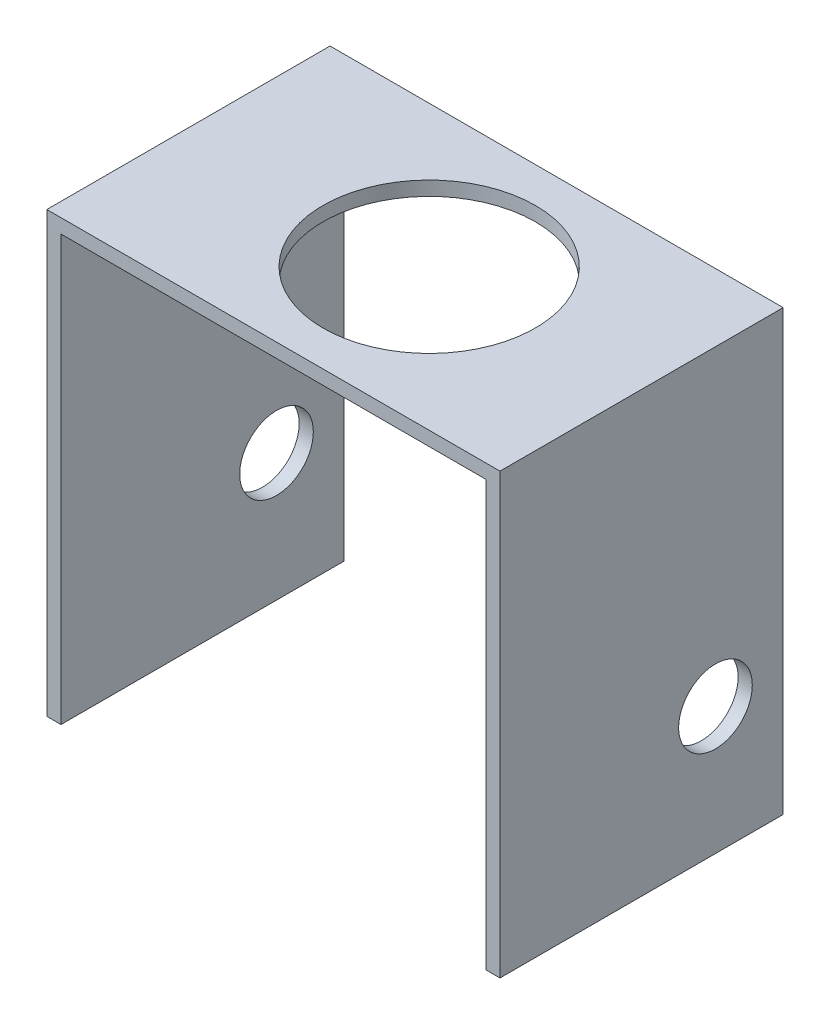
ISO-10303-21;
HEADER;
FILE_DESCRIPTION(('STEP AP214'),'2;1');
FILE_NAME('part.step','',(''),(''),'','','');
FILE_SCHEMA(('AUTOMOTIVE_DESIGN { 1 0 10303 214 1 1 1 1 }'));
ENDSEC;
DATA;
#1=APPLICATION_CONTEXT('core data for automotive mechanical design processes');
#2=APPLICATION_PROTOCOL_DEFINITION('international standard','automotive_design',2000,#1);
#3=PRODUCT_CONTEXT('',#1,'mechanical');
#4=PRODUCT('Part','Part','',(#3));
#5=PRODUCT_RELATED_PRODUCT_CATEGORY('part','',(#4));
#6=PRODUCT_DEFINITION_FORMATION('','',#4);
#7=PRODUCT_DEFINITION_CONTEXT('part definition',#1,'design');
#8=PRODUCT_DEFINITION('design','',#6,#7);
#9=PRODUCT_DEFINITION_SHAPE('','',#8);
#10=(LENGTH_UNIT() NAMED_UNIT(*) SI_UNIT(.MILLI.,.METRE.));
#11=(NAMED_UNIT(*) PLANE_ANGLE_UNIT() SI_UNIT($,.RADIAN.));
#12=(NAMED_UNIT(*) SI_UNIT($,.STERADIAN.) SOLID_ANGLE_UNIT());
#13=UNCERTAINTY_MEASURE_WITH_UNIT(LENGTH_MEASURE(1.E-05),#10,'distance_accuracy_value','');
#14=(GEOMETRIC_REPRESENTATION_CONTEXT(3) GLOBAL_UNCERTAINTY_ASSIGNED_CONTEXT((#13)) GLOBAL_UNIT_ASSIGNED_CONTEXT((#10,
#11,#12)) REPRESENTATION_CONTEXT('',''));
#15=CARTESIAN_POINT('',(0.,0.,0.));
#16=DIRECTION('',(0.,0.,1.));
#17=DIRECTION('',(1.,0.,0.));
#18=AXIS2_PLACEMENT_3D('',#15,#16,#17);
#19=CARTESIAN_POINT('',(-17.4296603939773,0.,20.));
#20=DIRECTION('',(1.,0.,0.));
#21=DIRECTION('',(0.,0.,-1.));
#22=AXIS2_PLACEMENT_3D('',#19,#20,#21);
#23=PLANE('',#22);
#24=CARTESIAN_POINT('',(-17.4296603939773,-5.92299932756769,4.78026352130753));
#25=DIRECTION('',(1.,0.,0.));
#26=DIRECTION('',(0.,0.,-1.));
#27=AXIS2_PLACEMENT_3D('',#24,#25,#26);
#28=CIRCLE('',#27,2.6);
#29=CARTESIAN_POINT('',(-17.4296603939773,-5.92299932756769,2.18026352130753));
#30=VERTEX_POINT('',#29);
#31=EDGE_CURVE('E153',#30,#30,#28,.T.);
#32=ORIENTED_EDGE('',*,*,#31,.F.);
#33=EDGE_LOOP('',(#32));
#34=FACE_BOUND('',#33,.T.);
#35=DIRECTION('',(0.,-1.,0.));
#36=VECTOR('',#35,1.);
#37=CARTESIAN_POINT('',(-17.4296603939773,0.,0.));
#38=LINE('',#37,#36);
#39=CARTESIAN_POINT('',(-17.4296603939773,15.0770006724323,0.));
#40=VERTEX_POINT('',#39);
#41=CARTESIAN_POINT('',(-17.4296603939773,-14.9229993275677,0.));
#42=VERTEX_POINT('',#41);
#43=EDGE_CURVE('E148',#40,#42,#38,.T.);
#44=ORIENTED_EDGE('',*,*,#43,.F.);
#45=DIRECTION('',(0.,0.,-1.));
#46=VECTOR('',#45,1.);
#47=CARTESIAN_POINT('',(-17.4296603939773,15.0770006724323,20.));
#48=LINE('',#47,#46);
#49=CARTESIAN_POINT('',(-17.4296603939773,15.0770006724323,20.));
#50=VERTEX_POINT('',#49);
#51=EDGE_CURVE('E11',#50,#40,#48,.T.);
#52=ORIENTED_EDGE('',*,*,#51,.F.);
#53=DIRECTION('',(0.,-1.,0.));
#54=VECTOR('',#53,1.);
#55=CARTESIAN_POINT('',(-17.4296603939773,0.,20.));
#56=LINE('',#55,#54);
#57=CARTESIAN_POINT('',(-17.4296603939773,-14.9229993275677,20.));
#58=VERTEX_POINT('',#57);
#59=EDGE_CURVE('E175',#50,#58,#56,.T.);
#60=ORIENTED_EDGE('',*,*,#59,.T.);
#61=DIRECTION('',(0.,0.,-1.));
#62=VECTOR('',#61,1.);
#63=CARTESIAN_POINT('',(-17.4296603939773,-14.9229993275677,20.));
#64=LINE('',#63,#62);
#65=EDGE_CURVE('E98',#58,#42,#64,.T.);
#66=ORIENTED_EDGE('',*,*,#65,.T.);
#67=EDGE_LOOP('',(#44,#52,#60,#66));
#68=FACE_BOUND('',#67,.T.);
#69=ADVANCED_FACE('F47',(#34,#68),#23,.T.);
#70=CARTESIAN_POINT('',(0.,15.0770006724323,20.));
#71=DIRECTION('',(0.,1.,0.));
#72=DIRECTION('',(0.,0.,1.));
#73=AXIS2_PLACEMENT_3D('',#70,#71,#72);
#74=PLANE('',#73);
#75=CARTESIAN_POINT('',(-1.42966039397729,15.0770006724323,10.));
#76=DIRECTION('',(0.,1.,0.));
#77=DIRECTION('',(0.,0.,1.));
#78=AXIS2_PLACEMENT_3D('',#75,#76,#77);
#79=CIRCLE('',#78,7.5);
#80=CARTESIAN_POINT('',(-1.42966039397729,15.0770006724323,17.5));
#81=VERTEX_POINT('',#80);
#82=EDGE_CURVE('E226',#81,#81,#79,.T.);
#83=ORIENTED_EDGE('',*,*,#82,.T.);
#84=EDGE_LOOP('',(#83));
#85=FACE_BOUND('',#84,.T.);
#86=DIRECTION('',(1.,0.,0.));
#87=VECTOR('',#86,1.);
#88=CARTESIAN_POINT('',(0.,15.0770006724323,0.));
#89=LINE('',#88,#87);
#90=CARTESIAN_POINT('',(12.5703396060227,15.0770006724323,0.));
#91=VERTEX_POINT('',#90);
#92=EDGE_CURVE('E152',#40,#91,#89,.T.);
#93=ORIENTED_EDGE('',*,*,#92,.T.);
#94=DIRECTION('',(0.,0.,-1.));
#95=VECTOR('',#94,1.);
#96=CARTESIAN_POINT('',(12.5703396060227,15.0770006724323,20.));
#97=LINE('',#96,#95);
#98=CARTESIAN_POINT('',(12.5703396060227,15.0770006724323,20.));
#99=VERTEX_POINT('',#98);
#100=EDGE_CURVE('E56',#99,#91,#97,.T.);
#101=ORIENTED_EDGE('',*,*,#100,.F.);
#102=DIRECTION('',(1.,0.,0.));
#103=VECTOR('',#102,1.);
#104=CARTESIAN_POINT('',(0.,15.0770006724323,20.));
#105=LINE('',#104,#103);
#106=EDGE_CURVE('E207',#50,#99,#105,.T.);
#107=ORIENTED_EDGE('',*,*,#106,.F.);
#108=ORIENTED_EDGE('',*,*,#51,.T.);
#109=EDGE_LOOP('',(#93,#101,#107,#108));
#110=FACE_BOUND('',#109,.T.);
#111=ADVANCED_FACE('F256',(#85,#110),#74,.F.);
#112=CARTESIAN_POINT('',(12.5703396060227,0.,20.));
#113=DIRECTION('',(1.,0.,0.));
#114=DIRECTION('',(0.,1.,0.));
#115=AXIS2_PLACEMENT_3D('',#112,#113,#114);
#116=PLANE('',#115);
#117=CARTESIAN_POINT('',(12.5703396060227,-5.92299932756769,4.78026352130753));
#118=DIRECTION('',(1.,0.,0.));
#119=DIRECTION('',(0.,1.,0.));
#120=AXIS2_PLACEMENT_3D('',#117,#118,#119);
#121=CIRCLE('',#120,2.6);
#122=CARTESIAN_POINT('',(12.5703396060227,-3.32299932756769,4.78026352130753));
#123=VERTEX_POINT('',#122);
#124=EDGE_CURVE('E217',#123,#123,#121,.T.);
#125=ORIENTED_EDGE('',*,*,#124,.T.);
#126=EDGE_LOOP('',(#125));
#127=FACE_BOUND('',#126,.T.);
#128=DIRECTION('',(0.,-1.,0.));
#129=VECTOR('',#128,1.);
#130=CARTESIAN_POINT('',(12.5703396060227,0.,0.));
#131=LINE('',#130,#129);
#132=CARTESIAN_POINT('',(12.5703396060227,-14.9229993275677,0.));
#133=VERTEX_POINT('',#132);
#134=EDGE_CURVE('E156',#91,#133,#131,.T.);
#135=ORIENTED_EDGE('',*,*,#134,.T.);
#136=DIRECTION('',(0.,0.,-1.));
#137=VECTOR('',#136,1.);
#138=CARTESIAN_POINT('',(12.5703396060227,-14.9229993275677,20.));
#139=LINE('',#138,#137);
#140=CARTESIAN_POINT('',(12.5703396060227,-14.9229993275677,20.));
#141=VERTEX_POINT('',#140);
#142=EDGE_CURVE('E185',#141,#133,#139,.T.);
#143=ORIENTED_EDGE('',*,*,#142,.F.);
#144=DIRECTION('',(0.,-1.,0.));
#145=VECTOR('',#144,1.);
#146=CARTESIAN_POINT('',(12.5703396060227,0.,20.));
#147=LINE('',#146,#145);
#148=EDGE_CURVE('E195',#99,#141,#147,.T.);
#149=ORIENTED_EDGE('',*,*,#148,.F.);
#150=ORIENTED_EDGE('',*,*,#100,.T.);
#151=EDGE_LOOP('',(#135,#143,#149,#150));
#152=FACE_BOUND('',#151,.T.);
#153=ADVANCED_FACE('F193',(#127,#152),#116,.F.);
#154=CARTESIAN_POINT('',(0.,-14.9229993275677,20.));
#155=DIRECTION('',(0.,-1.,0.));
#156=DIRECTION('',(0.,0.,-1.));
#157=AXIS2_PLACEMENT_3D('',#154,#155,#156);
#158=PLANE('',#157);
#159=DIRECTION('',(-1.,0.,0.));
#160=VECTOR('',#159,1.);
#161=CARTESIAN_POINT('',(0.,-14.9229993275677,0.));
#162=LINE('',#161,#160);
#163=CARTESIAN_POINT('',(13.5703396060227,-14.9229993275677,0.));
#164=VERTEX_POINT('',#163);
#165=EDGE_CURVE('E160',#164,#133,#162,.T.);
#166=ORIENTED_EDGE('',*,*,#165,.F.);
#167=DIRECTION('',(0.,0.,-1.));
#168=VECTOR('',#167,1.);
#169=CARTESIAN_POINT('',(13.5703396060227,-14.9229993275677,20.));
#170=LINE('',#169,#168);
#171=CARTESIAN_POINT('',(13.5703396060227,-14.9229993275677,20.));
#172=VERTEX_POINT('',#171);
#173=EDGE_CURVE('E182',#172,#164,#170,.T.);
#174=ORIENTED_EDGE('',*,*,#173,.F.);
#175=DIRECTION('',(-1.,0.,0.));
#176=VECTOR('',#175,1.);
#177=CARTESIAN_POINT('',(0.,-14.9229993275677,20.));
#178=LINE('',#177,#176);
#179=EDGE_CURVE('E142',#172,#141,#178,.T.);
#180=ORIENTED_EDGE('',*,*,#179,.T.);
#181=ORIENTED_EDGE('',*,*,#142,.T.);
#182=EDGE_LOOP('',(#166,#174,#180,#181));
#183=FACE_BOUND('',#182,.T.);
#184=ADVANCED_FACE('F203',(#183),#158,.T.);
#185=CARTESIAN_POINT('',(13.5703396060227,0.,20.));
#186=DIRECTION('',(-1.,0.,0.));
#187=DIRECTION('',(0.,0.,1.));
#188=AXIS2_PLACEMENT_3D('',#185,#186,#187);
#189=PLANE('',#188);
#190=CARTESIAN_POINT('',(13.5703396060227,-5.92299932756769,4.78026352130753));
#191=DIRECTION('',(1.,0.,0.));
#192=DIRECTION('',(0.,0.,-1.));
#193=AXIS2_PLACEMENT_3D('',#190,#191,#192);
#194=CIRCLE('',#193,2.6);
#195=CARTESIAN_POINT('',(13.5703396060227,-5.92299932756769,2.18026352130753));
#196=VERTEX_POINT('',#195);
#197=EDGE_CURVE('E222',#196,#196,#194,.T.);
#198=ORIENTED_EDGE('',*,*,#197,.F.);
#199=EDGE_LOOP('',(#198));
#200=FACE_BOUND('',#199,.T.);
#201=DIRECTION('',(0.,1.,0.));
#202=VECTOR('',#201,1.);
#203=CARTESIAN_POINT('',(13.5703396060227,0.,0.));
#204=LINE('',#203,#202);
#205=CARTESIAN_POINT('',(13.5703396060227,16.0770006724323,0.));
#206=VERTEX_POINT('',#205);
#207=EDGE_CURVE('E164',#164,#206,#204,.T.);
#208=ORIENTED_EDGE('',*,*,#207,.T.);
#209=DIRECTION('',(0.,0.,-1.));
#210=VECTOR('',#209,1.);
#211=CARTESIAN_POINT('',(13.5703396060227,16.0770006724323,20.));
#212=LINE('',#211,#210);
#213=CARTESIAN_POINT('',(13.5703396060227,16.0770006724323,20.));
#214=VERTEX_POINT('',#213);
#215=EDGE_CURVE('E127',#214,#206,#212,.T.);
#216=ORIENTED_EDGE('',*,*,#215,.F.);
#217=DIRECTION('',(0.,1.,0.));
#218=VECTOR('',#217,1.);
#219=CARTESIAN_POINT('',(13.5703396060227,0.,20.));
#220=LINE('',#219,#218);
#221=EDGE_CURVE('E137',#172,#214,#220,.T.);
#222=ORIENTED_EDGE('',*,*,#221,.F.);
#223=ORIENTED_EDGE('',*,*,#173,.T.);
#224=EDGE_LOOP('',(#208,#216,#222,#223));
#225=FACE_BOUND('',#224,.T.);
#226=ADVANCED_FACE('F242',(#200,#225),#189,.F.);
#227=CARTESIAN_POINT('',(0.,16.0770006724323,20.));
#228=DIRECTION('',(0.,1.,0.));
#229=DIRECTION('',(0.,0.,1.));
#230=AXIS2_PLACEMENT_3D('',#227,#228,#229);
#231=PLANE('',#230);
#232=CARTESIAN_POINT('',(-1.42966039397729,16.0770006724323,10.));
#233=DIRECTION('',(0.,1.,0.));
#234=DIRECTION('',(0.,0.,1.));
#235=AXIS2_PLACEMENT_3D('',#232,#233,#234);
#236=CIRCLE('',#235,7.5);
#237=CARTESIAN_POINT('',(-1.42966039397729,16.0770006724323,17.5));
#238=VERTEX_POINT('',#237);
#239=EDGE_CURVE('E233',#238,#238,#236,.T.);
#240=ORIENTED_EDGE('',*,*,#239,.F.);
#241=EDGE_LOOP('',(#240));
#242=FACE_BOUND('',#241,.T.);
#243=DIRECTION('',(1.,0.,0.));
#244=VECTOR('',#243,1.);
#245=CARTESIAN_POINT('',(0.,16.0770006724323,0.));
#246=LINE('',#245,#244);
#247=CARTESIAN_POINT('',(-18.4296603939773,16.0770006724323,0.));
#248=VERTEX_POINT('',#247);
#249=EDGE_CURVE('E125',#248,#206,#246,.T.);
#250=ORIENTED_EDGE('',*,*,#249,.F.);
#251=DIRECTION('',(0.,0.,-1.));
#252=VECTOR('',#251,1.);
#253=CARTESIAN_POINT('',(-18.4296603939773,16.0770006724323,20.));
#254=LINE('',#253,#252);
#255=CARTESIAN_POINT('',(-18.4296603939773,16.0770006724323,20.));
#256=VERTEX_POINT('',#255);
#257=EDGE_CURVE('E119',#256,#248,#254,.T.);
#258=ORIENTED_EDGE('',*,*,#257,.F.);
#259=DIRECTION('',(1.,0.,0.));
#260=VECTOR('',#259,1.);
#261=CARTESIAN_POINT('',(0.,16.0770006724323,20.));
#262=LINE('',#261,#260);
#263=EDGE_CURVE('E123',#256,#214,#262,.T.);
#264=ORIENTED_EDGE('',*,*,#263,.T.);
#265=ORIENTED_EDGE('',*,*,#215,.T.);
#266=EDGE_LOOP('',(#250,#258,#264,#265));
#267=FACE_BOUND('',#266,.T.);
#268=ADVANCED_FACE('F121',(#242,#267),#231,.T.);
#269=CARTESIAN_POINT('',(-18.4296603939773,0.,20.));
#270=DIRECTION('',(1.,0.,0.));
#271=DIRECTION('',(0.,0.,-1.));
#272=AXIS2_PLACEMENT_3D('',#269,#270,#271);
#273=PLANE('',#272);
#274=CARTESIAN_POINT('',(-18.4296603939773,-5.92299932756769,4.78026352130753));
#275=DIRECTION('',(1.,0.,0.));
#276=DIRECTION('',(0.,0.,-1.));
#277=AXIS2_PLACEMENT_3D('',#274,#275,#276);
#278=CIRCLE('',#277,2.6);
#279=CARTESIAN_POINT('',(-18.4296603939773,-5.92299932756769,2.18026352130753));
#280=VERTEX_POINT('',#279);
#281=EDGE_CURVE('E221',#280,#280,#278,.T.);
#282=ORIENTED_EDGE('',*,*,#281,.T.);
#283=EDGE_LOOP('',(#282));
#284=FACE_BOUND('',#283,.T.);
#285=DIRECTION('',(0.,-1.,0.));
#286=VECTOR('',#285,1.);
#287=CARTESIAN_POINT('',(-18.4296603939773,0.,0.));
#288=LINE('',#287,#286);
#289=CARTESIAN_POINT('',(-18.4296603939773,-14.9229993275677,0.));
#290=VERTEX_POINT('',#289);
#291=EDGE_CURVE('E91',#248,#290,#288,.T.);
#292=ORIENTED_EDGE('',*,*,#291,.T.);
#293=DIRECTION('',(0.,0.,-1.));
#294=VECTOR('',#293,1.);
#295=CARTESIAN_POINT('',(-18.4296603939773,-14.9229993275677,20.));
#296=LINE('',#295,#294);
#297=CARTESIAN_POINT('',(-18.4296603939773,-14.9229993275677,20.));
#298=VERTEX_POINT('',#297);
#299=EDGE_CURVE('E128',#298,#290,#296,.T.);
#300=ORIENTED_EDGE('',*,*,#299,.F.);
#301=DIRECTION('',(0.,-1.,0.));
#302=VECTOR('',#301,1.);
#303=CARTESIAN_POINT('',(-18.4296603939773,0.,20.));
#304=LINE('',#303,#302);
#305=EDGE_CURVE('E130',#256,#298,#304,.T.);
#306=ORIENTED_EDGE('',*,*,#305,.F.);
#307=ORIENTED_EDGE('',*,*,#257,.T.);
#308=EDGE_LOOP('',(#292,#300,#306,#307));
#309=FACE_BOUND('',#308,.T.);
#310=ADVANCED_FACE('F131',(#284,#309),#273,.F.);
#311=CARTESIAN_POINT('',(0.,-14.9229993275677,20.));
#312=DIRECTION('',(0.,1.,0.));
#313=DIRECTION('',(0.,0.,1.));
#314=AXIS2_PLACEMENT_3D('',#311,#312,#313);
#315=PLANE('',#314);
#316=DIRECTION('',(1.,0.,0.));
#317=VECTOR('',#316,1.);
#318=CARTESIAN_POINT('',(0.,-14.9229993275677,0.));
#319=LINE('',#318,#317);
#320=EDGE_CURVE('E172',#290,#42,#319,.T.);
#321=ORIENTED_EDGE('',*,*,#320,.T.);
#322=ORIENTED_EDGE('',*,*,#65,.F.);
#323=DIRECTION('',(1.,0.,0.));
#324=VECTOR('',#323,1.);
#325=CARTESIAN_POINT('',(0.,-14.9229993275677,20.));
#326=LINE('',#325,#324);
#327=EDGE_CURVE('E64',#298,#58,#326,.T.);
#328=ORIENTED_EDGE('',*,*,#327,.F.);
#329=ORIENTED_EDGE('',*,*,#299,.T.);
#330=EDGE_LOOP('',(#321,#322,#328,#329));
#331=FACE_BOUND('',#330,.T.);
#332=ADVANCED_FACE('F249',(#331),#315,.F.);
#333=CARTESIAN_POINT('',(0.,0.,20.));
#334=DIRECTION('',(0.,0.,1.));
#335=DIRECTION('',(1.,0.,0.));
#336=AXIS2_PLACEMENT_3D('',#333,#334,#335);
#337=PLANE('',#336);
#338=ORIENTED_EDGE('',*,*,#59,.F.);
#339=ORIENTED_EDGE('',*,*,#106,.T.);
#340=ORIENTED_EDGE('',*,*,#148,.T.);
#341=ORIENTED_EDGE('',*,*,#179,.F.);
#342=ORIENTED_EDGE('',*,*,#221,.T.);
#343=ORIENTED_EDGE('',*,*,#263,.F.);
#344=ORIENTED_EDGE('',*,*,#305,.T.);
#345=ORIENTED_EDGE('',*,*,#327,.T.);
#346=EDGE_LOOP('',(#338,#339,#340,#341,#342,#343,#344,#345));
#347=FACE_BOUND('',#346,.T.);
#348=ADVANCED_FACE('F134',(#347),#337,.T.);
#349=CARTESIAN_POINT('',(0.,0.,0.));
#350=DIRECTION('',(0.,0.,1.));
#351=DIRECTION('',(1.,0.,0.));
#352=AXIS2_PLACEMENT_3D('',#349,#350,#351);
#353=PLANE('',#352);
#354=ORIENTED_EDGE('',*,*,#43,.T.);
#355=ORIENTED_EDGE('',*,*,#320,.F.);
#356=ORIENTED_EDGE('',*,*,#291,.F.);
#357=ORIENTED_EDGE('',*,*,#249,.T.);
#358=ORIENTED_EDGE('',*,*,#207,.F.);
#359=ORIENTED_EDGE('',*,*,#165,.T.);
#360=ORIENTED_EDGE('',*,*,#134,.F.);
#361=ORIENTED_EDGE('',*,*,#92,.F.);
#362=EDGE_LOOP('',(#354,#355,#356,#357,#358,#359,#360,#361));
#363=FACE_BOUND('',#362,.T.);
#364=ADVANCED_FACE('F199',(#363),#353,.F.);
#365=CARTESIAN_POINT('',(-18.4296603939773,-5.92299932756769,4.78026352130753));
#366=DIRECTION('',(1.,0.,0.));
#367=DIRECTION('',(0.,0.,-1.));
#368=AXIS2_PLACEMENT_3D('',#365,#366,#367);
#369=CYLINDRICAL_SURFACE('',#368,2.6);
#370=ORIENTED_EDGE('',*,*,#31,.T.);
#371=EDGE_LOOP('',(#370));
#372=FACE_BOUND('',#371,.T.);
#373=ORIENTED_EDGE('',*,*,#281,.F.);
#374=EDGE_LOOP('',(#373));
#375=FACE_BOUND('',#374,.T.);
#376=ADVANCED_FACE('F274',(#372,#375),#369,.F.);
#377=ORIENTED_EDGE('',*,*,#197,.T.);
#378=EDGE_LOOP('',(#377));
#379=FACE_BOUND('',#378,.T.);
#380=ORIENTED_EDGE('',*,*,#124,.F.);
#381=EDGE_LOOP('',(#380));
#382=FACE_BOUND('',#381,.T.);
#383=ADVANCED_FACE('F278',(#379,#382),#369,.F.);
#384=CARTESIAN_POINT('',(-1.42966039397729,-14.9229993275677,10.));
#385=DIRECTION('',(0.,1.,0.));
#386=DIRECTION('',(0.,0.,1.));
#387=AXIS2_PLACEMENT_3D('',#384,#385,#386);
#388=CYLINDRICAL_SURFACE('',#387,7.5);
#389=ORIENTED_EDGE('',*,*,#239,.T.);
#390=EDGE_LOOP('',(#389));
#391=FACE_BOUND('',#390,.T.);
#392=ORIENTED_EDGE('',*,*,#82,.F.);
#393=EDGE_LOOP('',(#392));
#394=FACE_BOUND('',#393,.T.);
#395=ADVANCED_FACE('F238',(#391,#394),#388,.F.);
#396=CLOSED_SHELL('',(#69,#111,#153,#184,#226,#268,#310,#332,#348,#364,#376,#383,#395));
#397=MANIFOLD_SOLID_BREP('B2',#396);
#398=ADVANCED_BREP_SHAPE_REPRESENTATION('',(#18,#397),#14);
#399=SHAPE_DEFINITION_REPRESENTATION(#9,#398);
ENDSEC;
END-ISO-10303-21;
